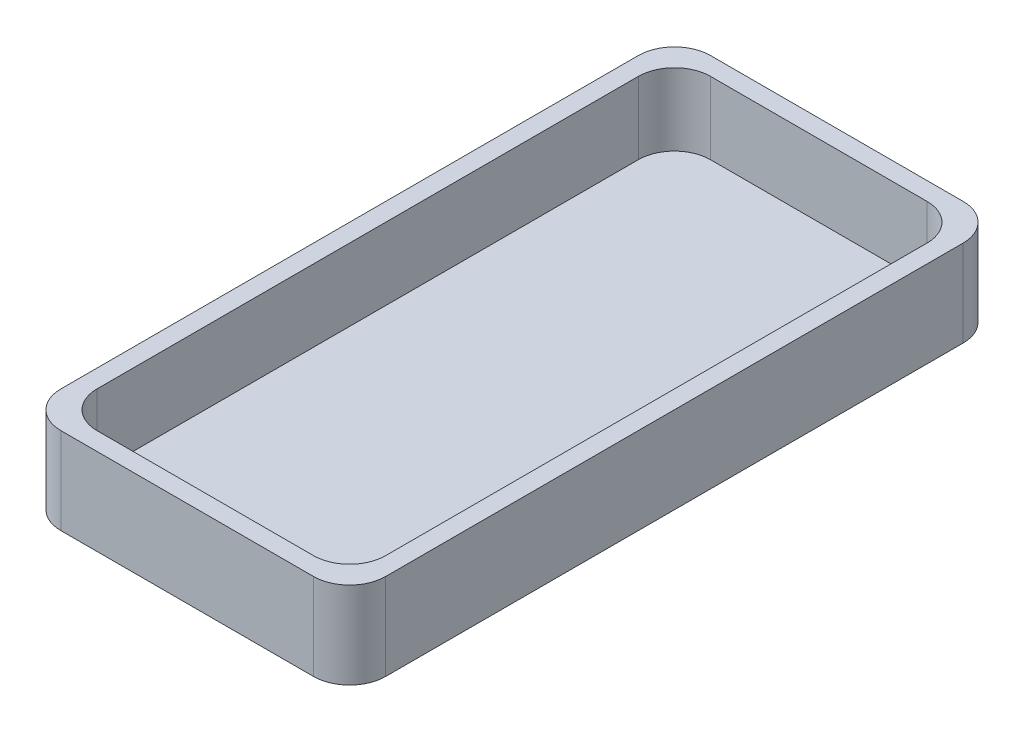
ISO-10303-21;
HEADER;
FILE_DESCRIPTION(('STEP AP214'),'2;1');
FILE_NAME('part.step','',(''),(''),'','','');
FILE_SCHEMA(('AUTOMOTIVE_DESIGN { 1 0 10303 214 1 1 1 1 }'));
ENDSEC;
DATA;
#1=APPLICATION_CONTEXT('core data for automotive mechanical design processes');
#2=APPLICATION_PROTOCOL_DEFINITION('international standard','automotive_design',2000,#1);
#3=PRODUCT_CONTEXT('',#1,'mechanical');
#4=PRODUCT('Part','Part','',(#3));
#5=PRODUCT_RELATED_PRODUCT_CATEGORY('part','',(#4));
#6=PRODUCT_DEFINITION_FORMATION('','',#4);
#7=PRODUCT_DEFINITION_CONTEXT('part definition',#1,'design');
#8=PRODUCT_DEFINITION('design','',#6,#7);
#9=PRODUCT_DEFINITION_SHAPE('','',#8);
#10=(LENGTH_UNIT() NAMED_UNIT(*) SI_UNIT(.MILLI.,.METRE.));
#11=(NAMED_UNIT(*) PLANE_ANGLE_UNIT() SI_UNIT($,.RADIAN.));
#12=(NAMED_UNIT(*) SI_UNIT($,.STERADIAN.) SOLID_ANGLE_UNIT());
#13=UNCERTAINTY_MEASURE_WITH_UNIT(LENGTH_MEASURE(1.E-05),#10,'distance_accuracy_value','');
#14=(GEOMETRIC_REPRESENTATION_CONTEXT(3) GLOBAL_UNCERTAINTY_ASSIGNED_CONTEXT((#13)) GLOBAL_UNIT_ASSIGNED_CONTEXT((#10,
#11,#12)) REPRESENTATION_CONTEXT('',''));
#15=CARTESIAN_POINT('',(0.,0.,0.));
#16=DIRECTION('',(0.,0.,1.));
#17=DIRECTION('',(1.,0.,0.));
#18=AXIS2_PLACEMENT_3D('',#15,#16,#17);
#19=CARTESIAN_POINT('',(35.,24.,80.));
#20=DIRECTION('',(0.,-1.,0.));
#21=DIRECTION('',(0.,0.,-1.));
#22=AXIS2_PLACEMENT_3D('',#19,#20,#21);
#23=CYLINDRICAL_SURFACE('',#22,10.);
#24=CARTESIAN_POINT('',(35.,0.,80.));
#25=DIRECTION('',(0.,1.,0.));
#26=DIRECTION('',(0.,0.,1.));
#27=AXIS2_PLACEMENT_3D('',#24,#25,#26);
#28=CIRCLE('',#27,10.);
#29=CARTESIAN_POINT('',(34.9999999999999,0.,90.));
#30=VERTEX_POINT('',#29);
#31=CARTESIAN_POINT('',(45.,0.,79.9999999999999));
#32=VERTEX_POINT('',#31);
#33=EDGE_CURVE('E145',#30,#32,#28,.T.);
#34=ORIENTED_EDGE('',*,*,#33,.T.);
#35=DIRECTION('',(0.,-1.,0.));
#36=VECTOR('',#35,1.);
#37=CARTESIAN_POINT('',(45.,24.,79.9999999999999));
#38=LINE('',#37,#36);
#39=CARTESIAN_POINT('',(45.,24.,79.9999999999999));
#40=VERTEX_POINT('',#39);
#41=EDGE_CURVE('E11',#40,#32,#38,.T.);
#42=ORIENTED_EDGE('',*,*,#41,.F.);
#43=CARTESIAN_POINT('',(35.,24.,80.));
#44=DIRECTION('',(0.,1.,0.));
#45=DIRECTION('',(0.,0.,1.));
#46=AXIS2_PLACEMENT_3D('',#43,#44,#45);
#47=CIRCLE('',#46,10.);
#48=CARTESIAN_POINT('',(34.9999999999999,24.,90.));
#49=VERTEX_POINT('',#48);
#50=EDGE_CURVE('E161',#49,#40,#47,.T.);
#51=ORIENTED_EDGE('',*,*,#50,.F.);
#52=DIRECTION('',(0.,-1.,0.));
#53=VECTOR('',#52,1.);
#54=CARTESIAN_POINT('',(34.9999999999999,24.,90.));
#55=LINE('',#54,#53);
#56=EDGE_CURVE('E141',#49,#30,#55,.T.);
#57=ORIENTED_EDGE('',*,*,#56,.T.);
#58=EDGE_LOOP('',(#34,#42,#51,#57));
#59=FACE_BOUND('',#58,.T.);
#60=ADVANCED_FACE('F37',(#59),#23,.T.);
#61=CARTESIAN_POINT('',(45.,24.,79.9999999999999));
#62=DIRECTION('',(-1.,0.,0.));
#63=DIRECTION('',(0.,0.,1.));
#64=AXIS2_PLACEMENT_3D('',#61,#62,#63);
#65=PLANE('',#64);
#66=DIRECTION('',(0.,0.,-1.));
#67=VECTOR('',#66,1.);
#68=CARTESIAN_POINT('',(45.,0.,79.9999999999999));
#69=LINE('',#68,#67);
#70=CARTESIAN_POINT('',(45.,0.,-79.9999999999999));
#71=VERTEX_POINT('',#70);
#72=EDGE_CURVE('E148',#32,#71,#69,.T.);
#73=ORIENTED_EDGE('',*,*,#72,.T.);
#74=DIRECTION('',(0.,-1.,0.));
#75=VECTOR('',#74,1.);
#76=CARTESIAN_POINT('',(45.,24.,-79.9999999999999));
#77=LINE('',#76,#75);
#78=CARTESIAN_POINT('',(45.,24.,-79.9999999999999));
#79=VERTEX_POINT('',#78);
#80=EDGE_CURVE('E44',#79,#71,#77,.T.);
#81=ORIENTED_EDGE('',*,*,#80,.F.);
#82=DIRECTION('',(0.,0.,-1.));
#83=VECTOR('',#82,1.);
#84=CARTESIAN_POINT('',(45.,24.,79.9999999999999));
#85=LINE('',#84,#83);
#86=EDGE_CURVE('E101',#40,#79,#85,.T.);
#87=ORIENTED_EDGE('',*,*,#86,.F.);
#88=ORIENTED_EDGE('',*,*,#41,.T.);
#89=EDGE_LOOP('',(#73,#81,#87,#88));
#90=FACE_BOUND('',#89,.T.);
#91=ADVANCED_FACE('F335',(#90),#65,.F.);
#92=CARTESIAN_POINT('',(35.,24.,-80.));
#93=DIRECTION('',(0.,-1.,0.));
#94=DIRECTION('',(0.,0.,-1.));
#95=AXIS2_PLACEMENT_3D('',#92,#93,#94);
#96=CYLINDRICAL_SURFACE('',#95,10.);
#97=CARTESIAN_POINT('',(35.,0.,-80.));
#98=DIRECTION('',(0.,1.,0.));
#99=DIRECTION('',(0.,0.,1.));
#100=AXIS2_PLACEMENT_3D('',#97,#98,#99);
#101=CIRCLE('',#100,10.);
#102=CARTESIAN_POINT('',(34.9999999999999,0.,-90.));
#103=VERTEX_POINT('',#102);
#104=EDGE_CURVE('E151',#71,#103,#101,.T.);
#105=ORIENTED_EDGE('',*,*,#104,.T.);
#106=DIRECTION('',(0.,-1.,0.));
#107=VECTOR('',#106,1.);
#108=CARTESIAN_POINT('',(34.9999999999999,24.,-90.));
#109=LINE('',#108,#107);
#110=CARTESIAN_POINT('',(34.9999999999999,24.,-90.));
#111=VERTEX_POINT('',#110);
#112=EDGE_CURVE('E168',#111,#103,#109,.T.);
#113=ORIENTED_EDGE('',*,*,#112,.F.);
#114=CARTESIAN_POINT('',(35.,24.,-80.));
#115=DIRECTION('',(0.,1.,0.));
#116=DIRECTION('',(0.,0.,1.));
#117=AXIS2_PLACEMENT_3D('',#114,#115,#116);
#118=CIRCLE('',#117,10.);
#119=EDGE_CURVE('E176',#79,#111,#118,.T.);
#120=ORIENTED_EDGE('',*,*,#119,.F.);
#121=ORIENTED_EDGE('',*,*,#80,.T.);
#122=EDGE_LOOP('',(#105,#113,#120,#121));
#123=FACE_BOUND('',#122,.T.);
#124=ADVANCED_FACE('F174',(#123),#96,.T.);
#125=CARTESIAN_POINT('',(34.9999999999999,24.,-90.));
#126=DIRECTION('',(0.,0.,1.));
#127=DIRECTION('',(1.,0.,0.));
#128=AXIS2_PLACEMENT_3D('',#125,#126,#127);
#129=PLANE('',#128);
#130=DIRECTION('',(-1.,0.,0.));
#131=VECTOR('',#130,1.);
#132=CARTESIAN_POINT('',(34.9999999999999,0.,-90.));
#133=LINE('',#132,#131);
#134=CARTESIAN_POINT('',(-35.,0.,-90.));
#135=VERTEX_POINT('',#134);
#136=EDGE_CURVE('E153',#103,#135,#133,.T.);
#137=ORIENTED_EDGE('',*,*,#136,.T.);
#138=DIRECTION('',(0.,-1.,0.));
#139=VECTOR('',#138,1.);
#140=CARTESIAN_POINT('',(-35.,24.,-90.));
#141=LINE('',#140,#139);
#142=CARTESIAN_POINT('',(-35.,24.,-90.));
#143=VERTEX_POINT('',#142);
#144=EDGE_CURVE('E165',#143,#135,#141,.T.);
#145=ORIENTED_EDGE('',*,*,#144,.F.);
#146=DIRECTION('',(-1.,0.,0.));
#147=VECTOR('',#146,1.);
#148=CARTESIAN_POINT('',(34.9999999999999,24.,-90.));
#149=LINE('',#148,#147);
#150=EDGE_CURVE('E188',#111,#143,#149,.T.);
#151=ORIENTED_EDGE('',*,*,#150,.F.);
#152=ORIENTED_EDGE('',*,*,#112,.T.);
#153=EDGE_LOOP('',(#137,#145,#151,#152));
#154=FACE_BOUND('',#153,.T.);
#155=ADVANCED_FACE('F184',(#154),#129,.F.);
#156=CARTESIAN_POINT('',(-35.,24.,-80.));
#157=DIRECTION('',(0.,-1.,0.));
#158=DIRECTION('',(0.,0.,-1.));
#159=AXIS2_PLACEMENT_3D('',#156,#157,#158);
#160=CYLINDRICAL_SURFACE('',#159,10.);
#161=CARTESIAN_POINT('',(-35.,0.,-80.));
#162=DIRECTION('',(0.,1.,0.));
#163=DIRECTION('',(0.,0.,-1.));
#164=AXIS2_PLACEMENT_3D('',#161,#162,#163);
#165=CIRCLE('',#164,10.);
#166=CARTESIAN_POINT('',(-45.,0.,-79.9999999999999));
#167=VERTEX_POINT('',#166);
#168=EDGE_CURVE('E155',#135,#167,#165,.T.);
#169=ORIENTED_EDGE('',*,*,#168,.T.);
#170=DIRECTION('',(0.,-1.,0.));
#171=VECTOR('',#170,1.);
#172=CARTESIAN_POINT('',(-45.,24.,-79.9999999999999));
#173=LINE('',#172,#171);
#174=CARTESIAN_POINT('',(-45.,24.,-79.9999999999999));
#175=VERTEX_POINT('',#174);
#176=EDGE_CURVE('E136',#175,#167,#173,.T.);
#177=ORIENTED_EDGE('',*,*,#176,.F.);
#178=CARTESIAN_POINT('',(-35.,24.,-80.));
#179=DIRECTION('',(0.,1.,0.));
#180=DIRECTION('',(0.,0.,-1.));
#181=AXIS2_PLACEMENT_3D('',#178,#179,#180);
#182=CIRCLE('',#181,10.);
#183=EDGE_CURVE('E124',#143,#175,#182,.T.);
#184=ORIENTED_EDGE('',*,*,#183,.F.);
#185=ORIENTED_EDGE('',*,*,#144,.T.);
#186=EDGE_LOOP('',(#169,#177,#184,#185));
#187=FACE_BOUND('',#186,.T.);
#188=ADVANCED_FACE('F187',(#187),#160,.T.);
#189=CARTESIAN_POINT('',(-45.,24.,-79.9999999999999));
#190=DIRECTION('',(1.,0.,0.));
#191=DIRECTION('',(0.,0.,-1.));
#192=AXIS2_PLACEMENT_3D('',#189,#190,#191);
#193=PLANE('',#192);
#194=DIRECTION('',(0.,0.,1.));
#195=VECTOR('',#194,1.);
#196=CARTESIAN_POINT('',(-45.,0.,-79.9999999999999));
#197=LINE('',#196,#195);
#198=CARTESIAN_POINT('',(-45.,0.,79.9999999999999));
#199=VERTEX_POINT('',#198);
#200=EDGE_CURVE('E133',#167,#199,#197,.T.);
#201=ORIENTED_EDGE('',*,*,#200,.T.);
#202=DIRECTION('',(0.,-1.,0.));
#203=VECTOR('',#202,1.);
#204=CARTESIAN_POINT('',(-45.,24.,79.9999999999999));
#205=LINE('',#204,#203);
#206=CARTESIAN_POINT('',(-45.,24.,79.9999999999999));
#207=VERTEX_POINT('',#206);
#208=EDGE_CURVE('E130',#207,#199,#205,.T.);
#209=ORIENTED_EDGE('',*,*,#208,.F.);
#210=DIRECTION('',(0.,0.,1.));
#211=VECTOR('',#210,1.);
#212=CARTESIAN_POINT('',(-45.,24.,-79.9999999999999));
#213=LINE('',#212,#211);
#214=EDGE_CURVE('E117',#175,#207,#213,.T.);
#215=ORIENTED_EDGE('',*,*,#214,.F.);
#216=ORIENTED_EDGE('',*,*,#176,.T.);
#217=EDGE_LOOP('',(#201,#209,#215,#216));
#218=FACE_BOUND('',#217,.T.);
#219=ADVANCED_FACE('F131',(#218),#193,.F.);
#220=CARTESIAN_POINT('',(-35.,24.,80.));
#221=DIRECTION('',(0.,-1.,0.));
#222=DIRECTION('',(0.,0.,-1.));
#223=AXIS2_PLACEMENT_3D('',#220,#221,#222);
#224=CYLINDRICAL_SURFACE('',#223,10.);
#225=CARTESIAN_POINT('',(-35.,0.,80.));
#226=DIRECTION('',(0.,1.,0.));
#227=DIRECTION('',(0.,0.,1.));
#228=AXIS2_PLACEMENT_3D('',#225,#226,#227);
#229=CIRCLE('',#228,10.);
#230=CARTESIAN_POINT('',(-34.9999999999999,0.,90.));
#231=VERTEX_POINT('',#230);
#232=EDGE_CURVE('E158',#199,#231,#229,.T.);
#233=ORIENTED_EDGE('',*,*,#232,.T.);
#234=DIRECTION('',(0.,-1.,0.));
#235=VECTOR('',#234,1.);
#236=CARTESIAN_POINT('',(-34.9999999999999,24.,90.));
#237=LINE('',#236,#235);
#238=CARTESIAN_POINT('',(-34.9999999999999,24.,90.));
#239=VERTEX_POINT('',#238);
#240=EDGE_CURVE('E137',#239,#231,#237,.T.);
#241=ORIENTED_EDGE('',*,*,#240,.F.);
#242=CARTESIAN_POINT('',(-35.,24.,80.));
#243=DIRECTION('',(0.,1.,0.));
#244=DIRECTION('',(0.,0.,1.));
#245=AXIS2_PLACEMENT_3D('',#242,#243,#244);
#246=CIRCLE('',#245,10.);
#247=EDGE_CURVE('E121',#207,#239,#246,.T.);
#248=ORIENTED_EDGE('',*,*,#247,.F.);
#249=ORIENTED_EDGE('',*,*,#208,.T.);
#250=EDGE_LOOP('',(#233,#241,#248,#249));
#251=FACE_BOUND('',#250,.T.);
#252=ADVANCED_FACE('F139',(#251),#224,.T.);
#253=CARTESIAN_POINT('',(-34.9999999999999,24.,90.));
#254=DIRECTION('',(0.,0.,-1.));
#255=DIRECTION('',(-1.,0.,0.));
#256=AXIS2_PLACEMENT_3D('',#253,#254,#255);
#257=PLANE('',#256);
#258=DIRECTION('',(1.,0.,0.));
#259=VECTOR('',#258,1.);
#260=CARTESIAN_POINT('',(-34.9999999999999,0.,90.));
#261=LINE('',#260,#259);
#262=EDGE_CURVE('E93',#231,#30,#261,.T.);
#263=ORIENTED_EDGE('',*,*,#262,.T.);
#264=ORIENTED_EDGE('',*,*,#56,.F.);
#265=DIRECTION('',(1.,0.,0.));
#266=VECTOR('',#265,1.);
#267=CARTESIAN_POINT('',(-34.9999999999999,24.,90.));
#268=LINE('',#267,#266);
#269=EDGE_CURVE('E60',#239,#49,#268,.T.);
#270=ORIENTED_EDGE('',*,*,#269,.F.);
#271=ORIENTED_EDGE('',*,*,#240,.T.);
#272=EDGE_LOOP('',(#263,#264,#270,#271));
#273=FACE_BOUND('',#272,.T.);
#274=ADVANCED_FACE('F342',(#273),#257,.F.);
#275=CARTESIAN_POINT('',(35.,24.,80.));
#276=DIRECTION('',(0.,1.,0.));
#277=DIRECTION('',(0.,0.,1.));
#278=AXIS2_PLACEMENT_3D('',#275,#276,#277);
#279=PLANE('',#278);
#280=CARTESIAN_POINT('',(30.,24.,75.));
#281=DIRECTION('',(0.,1.,0.));
#282=DIRECTION('',(0.,0.,1.));
#283=AXIS2_PLACEMENT_3D('',#280,#281,#282);
#284=CIRCLE('',#283,10.);
#285=CARTESIAN_POINT('',(29.9999999999999,24.,85.));
#286=VERTEX_POINT('',#285);
#287=CARTESIAN_POINT('',(40.,24.,74.9999999999999));
#288=VERTEX_POINT('',#287);
#289=EDGE_CURVE('E51',#286,#288,#284,.T.);
#290=ORIENTED_EDGE('',*,*,#289,.F.);
#291=DIRECTION('',(1.,0.,0.));
#292=VECTOR('',#291,1.);
#293=CARTESIAN_POINT('',(-29.9999999999999,24.,85.));
#294=LINE('',#293,#292);
#295=CARTESIAN_POINT('',(-29.9999999999999,24.,85.));
#296=VERTEX_POINT('',#295);
#297=EDGE_CURVE('E216',#296,#286,#294,.T.);
#298=ORIENTED_EDGE('',*,*,#297,.F.);
#299=CARTESIAN_POINT('',(-30.,24.,75.));
#300=DIRECTION('',(0.,1.,0.));
#301=DIRECTION('',(0.,0.,1.));
#302=AXIS2_PLACEMENT_3D('',#299,#300,#301);
#303=CIRCLE('',#302,9.99999999999999);
#304=CARTESIAN_POINT('',(-40.,24.,74.9999999999999));
#305=VERTEX_POINT('',#304);
#306=EDGE_CURVE('E220',#305,#296,#303,.T.);
#307=ORIENTED_EDGE('',*,*,#306,.F.);
#308=DIRECTION('',(0.,0.,1.));
#309=VECTOR('',#308,1.);
#310=CARTESIAN_POINT('',(-40.,24.,-74.9999999999999));
#311=LINE('',#310,#309);
#312=CARTESIAN_POINT('',(-40.,24.,-74.9999999999999));
#313=VERTEX_POINT('',#312);
#314=EDGE_CURVE('E223',#313,#305,#311,.T.);
#315=ORIENTED_EDGE('',*,*,#314,.F.);
#316=CARTESIAN_POINT('',(-30.,24.,-75.));
#317=DIRECTION('',(0.,1.,0.));
#318=DIRECTION('',(0.,0.,-1.));
#319=AXIS2_PLACEMENT_3D('',#316,#317,#318);
#320=CIRCLE('',#319,9.99999999999999);
#321=CARTESIAN_POINT('',(-30.,24.,-85.));
#322=VERTEX_POINT('',#321);
#323=EDGE_CURVE('E226',#322,#313,#320,.T.);
#324=ORIENTED_EDGE('',*,*,#323,.F.);
#325=DIRECTION('',(-1.,0.,0.));
#326=VECTOR('',#325,1.);
#327=CARTESIAN_POINT('',(29.9999999999999,24.,-85.));
#328=LINE('',#327,#326);
#329=CARTESIAN_POINT('',(29.9999999999999,24.,-85.));
#330=VERTEX_POINT('',#329);
#331=EDGE_CURVE('E229',#330,#322,#328,.T.);
#332=ORIENTED_EDGE('',*,*,#331,.F.);
#333=CARTESIAN_POINT('',(30.,24.,-75.));
#334=DIRECTION('',(0.,1.,0.));
#335=DIRECTION('',(0.,0.,1.));
#336=AXIS2_PLACEMENT_3D('',#333,#334,#335);
#337=CIRCLE('',#336,10.);
#338=CARTESIAN_POINT('',(40.,24.,-75.));
#339=VERTEX_POINT('',#338);
#340=EDGE_CURVE('E232',#339,#330,#337,.T.);
#341=ORIENTED_EDGE('',*,*,#340,.F.);
#342=DIRECTION('',(0.,0.,-1.));
#343=VECTOR('',#342,1.);
#344=CARTESIAN_POINT('',(40.,24.,74.9999999999999));
#345=LINE('',#344,#343);
#346=EDGE_CURVE('E235',#288,#339,#345,.T.);
#347=ORIENTED_EDGE('',*,*,#346,.F.);
#348=EDGE_LOOP('',(#290,#298,#307,#315,#324,#332,#341,#347));
#349=FACE_BOUND('',#348,.T.);
#350=ORIENTED_EDGE('',*,*,#50,.T.);
#351=ORIENTED_EDGE('',*,*,#86,.T.);
#352=ORIENTED_EDGE('',*,*,#119,.T.);
#353=ORIENTED_EDGE('',*,*,#150,.T.);
#354=ORIENTED_EDGE('',*,*,#183,.T.);
#355=ORIENTED_EDGE('',*,*,#214,.T.);
#356=ORIENTED_EDGE('',*,*,#247,.T.);
#357=ORIENTED_EDGE('',*,*,#269,.T.);
#358=EDGE_LOOP('',(#350,#351,#352,#353,#354,#355,#356,#357));
#359=FACE_BOUND('',#358,.T.);
#360=ADVANCED_FACE('F119',(#349,#359),#279,.T.);
#361=CARTESIAN_POINT('',(35.,0.,80.));
#362=DIRECTION('',(0.,1.,0.));
#363=DIRECTION('',(0.,0.,1.));
#364=AXIS2_PLACEMENT_3D('',#361,#362,#363);
#365=PLANE('',#364);
#366=ORIENTED_EDGE('',*,*,#33,.F.);
#367=ORIENTED_EDGE('',*,*,#262,.F.);
#368=ORIENTED_EDGE('',*,*,#232,.F.);
#369=ORIENTED_EDGE('',*,*,#200,.F.);
#370=ORIENTED_EDGE('',*,*,#168,.F.);
#371=ORIENTED_EDGE('',*,*,#136,.F.);
#372=ORIENTED_EDGE('',*,*,#104,.F.);
#373=ORIENTED_EDGE('',*,*,#72,.F.);
#374=EDGE_LOOP('',(#366,#367,#368,#369,#370,#371,#372,#373));
#375=FACE_BOUND('',#374,.T.);
#376=ADVANCED_FACE('F180',(#375),#365,.F.);
#377=CARTESIAN_POINT('',(30.,4.,75.));
#378=DIRECTION('',(0.,1.,0.));
#379=DIRECTION('',(0.,0.,1.));
#380=AXIS2_PLACEMENT_3D('',#377,#378,#379);
#381=CYLINDRICAL_SURFACE('',#380,10.);
#382=ORIENTED_EDGE('',*,*,#289,.T.);
#383=DIRECTION('',(0.,1.,0.));
#384=VECTOR('',#383,1.);
#385=CARTESIAN_POINT('',(40.,4.,74.9999999999999));
#386=LINE('',#385,#384);
#387=CARTESIAN_POINT('',(40.,4.,74.9999999999999));
#388=VERTEX_POINT('',#387);
#389=EDGE_CURVE('E194',#388,#288,#386,.T.);
#390=ORIENTED_EDGE('',*,*,#389,.F.);
#391=CARTESIAN_POINT('',(30.,4.,75.));
#392=DIRECTION('',(0.,1.,0.));
#393=DIRECTION('',(0.,0.,1.));
#394=AXIS2_PLACEMENT_3D('',#391,#392,#393);
#395=CIRCLE('',#394,10.);
#396=CARTESIAN_POINT('',(29.9999999999999,4.,85.));
#397=VERTEX_POINT('',#396);
#398=EDGE_CURVE('E219',#397,#388,#395,.T.);
#399=ORIENTED_EDGE('',*,*,#398,.F.);
#400=DIRECTION('',(0.,1.,0.));
#401=VECTOR('',#400,1.);
#402=CARTESIAN_POINT('',(29.9999999999999,4.,85.));
#403=LINE('',#402,#401);
#404=EDGE_CURVE('E149',#397,#286,#403,.T.);
#405=ORIENTED_EDGE('',*,*,#404,.T.);
#406=EDGE_LOOP('',(#382,#390,#399,#405));
#407=FACE_BOUND('',#406,.T.);
#408=ADVANCED_FACE('F268',(#407),#381,.F.);
#409=CARTESIAN_POINT('',(-29.9999999999999,4.,85.));
#410=DIRECTION('',(0.,0.,1.));
#411=DIRECTION('',(1.,0.,0.));
#412=AXIS2_PLACEMENT_3D('',#409,#410,#411);
#413=PLANE('',#412);
#414=ORIENTED_EDGE('',*,*,#297,.T.);
#415=ORIENTED_EDGE('',*,*,#404,.F.);
#416=DIRECTION('',(1.,0.,0.));
#417=VECTOR('',#416,1.);
#418=CARTESIAN_POINT('',(-29.9999999999999,4.,85.));
#419=LINE('',#418,#417);
#420=CARTESIAN_POINT('',(-29.9999999999999,4.,85.));
#421=VERTEX_POINT('',#420);
#422=EDGE_CURVE('E197',#421,#397,#419,.T.);
#423=ORIENTED_EDGE('',*,*,#422,.F.);
#424=DIRECTION('',(0.,1.,0.));
#425=VECTOR('',#424,1.);
#426=CARTESIAN_POINT('',(-29.9999999999999,4.,85.));
#427=LINE('',#426,#425);
#428=EDGE_CURVE('E212',#421,#296,#427,.T.);
#429=ORIENTED_EDGE('',*,*,#428,.T.);
#430=EDGE_LOOP('',(#414,#415,#423,#429));
#431=FACE_BOUND('',#430,.T.);
#432=ADVANCED_FACE('F288',(#431),#413,.F.);
#433=CARTESIAN_POINT('',(-30.,4.,75.));
#434=DIRECTION('',(0.,1.,0.));
#435=DIRECTION('',(0.,0.,1.));
#436=AXIS2_PLACEMENT_3D('',#433,#434,#435);
#437=CYLINDRICAL_SURFACE('',#436,9.99999999999999);
#438=ORIENTED_EDGE('',*,*,#306,.T.);
#439=ORIENTED_EDGE('',*,*,#428,.F.);
#440=CARTESIAN_POINT('',(-30.,4.,75.));
#441=DIRECTION('',(0.,1.,0.));
#442=DIRECTION('',(0.,0.,1.));
#443=AXIS2_PLACEMENT_3D('',#440,#441,#442);
#444=CIRCLE('',#443,9.99999999999999);
#445=CARTESIAN_POINT('',(-40.,4.,74.9999999999999));
#446=VERTEX_POINT('',#445);
#447=EDGE_CURVE('E241',#446,#421,#444,.T.);
#448=ORIENTED_EDGE('',*,*,#447,.F.);
#449=DIRECTION('',(0.,1.,0.));
#450=VECTOR('',#449,1.);
#451=CARTESIAN_POINT('',(-40.,4.,74.9999999999999));
#452=LINE('',#451,#450);
#453=EDGE_CURVE('E209',#446,#305,#452,.T.);
#454=ORIENTED_EDGE('',*,*,#453,.T.);
#455=EDGE_LOOP('',(#438,#439,#448,#454));
#456=FACE_BOUND('',#455,.T.);
#457=ADVANCED_FACE('F293',(#456),#437,.F.);
#458=CARTESIAN_POINT('',(-40.,4.,-74.9999999999999));
#459=DIRECTION('',(-1.,0.,0.));
#460=DIRECTION('',(0.,0.,1.));
#461=AXIS2_PLACEMENT_3D('',#458,#459,#460);
#462=PLANE('',#461);
#463=ORIENTED_EDGE('',*,*,#314,.T.);
#464=ORIENTED_EDGE('',*,*,#453,.F.);
#465=DIRECTION('',(0.,0.,1.));
#466=VECTOR('',#465,1.);
#467=CARTESIAN_POINT('',(-40.,4.,-74.9999999999999));
#468=LINE('',#467,#466);
#469=CARTESIAN_POINT('',(-40.,4.,-74.9999999999999));
#470=VERTEX_POINT('',#469);
#471=EDGE_CURVE('E244',#470,#446,#468,.T.);
#472=ORIENTED_EDGE('',*,*,#471,.F.);
#473=DIRECTION('',(0.,1.,0.));
#474=VECTOR('',#473,1.);
#475=CARTESIAN_POINT('',(-40.,4.,-74.9999999999999));
#476=LINE('',#475,#474);
#477=EDGE_CURVE('E206',#470,#313,#476,.T.);
#478=ORIENTED_EDGE('',*,*,#477,.T.);
#479=EDGE_LOOP('',(#463,#464,#472,#478));
#480=FACE_BOUND('',#479,.T.);
#481=ADVANCED_FACE('F319',(#480),#462,.F.);
#482=CARTESIAN_POINT('',(-30.,4.,-75.));
#483=DIRECTION('',(0.,1.,0.));
#484=DIRECTION('',(0.,0.,1.));
#485=AXIS2_PLACEMENT_3D('',#482,#483,#484);
#486=CYLINDRICAL_SURFACE('',#485,9.99999999999999);
#487=ORIENTED_EDGE('',*,*,#323,.T.);
#488=ORIENTED_EDGE('',*,*,#477,.F.);
#489=CARTESIAN_POINT('',(-30.,4.,-75.));
#490=DIRECTION('',(0.,1.,0.));
#491=DIRECTION('',(0.,0.,-1.));
#492=AXIS2_PLACEMENT_3D('',#489,#490,#491);
#493=CIRCLE('',#492,9.99999999999999);
#494=CARTESIAN_POINT('',(-30.,4.,-85.));
#495=VERTEX_POINT('',#494);
#496=EDGE_CURVE('E247',#495,#470,#493,.T.);
#497=ORIENTED_EDGE('',*,*,#496,.F.);
#498=DIRECTION('',(0.,1.,0.));
#499=VECTOR('',#498,1.);
#500=CARTESIAN_POINT('',(-30.,4.,-85.));
#501=LINE('',#500,#499);
#502=EDGE_CURVE('E203',#495,#322,#501,.T.);
#503=ORIENTED_EDGE('',*,*,#502,.T.);
#504=EDGE_LOOP('',(#487,#488,#497,#503));
#505=FACE_BOUND('',#504,.T.);
#506=ADVANCED_FACE('F322',(#505),#486,.F.);
#507=CARTESIAN_POINT('',(29.9999999999999,4.,-85.));
#508=DIRECTION('',(0.,0.,-1.));
#509=DIRECTION('',(-1.,0.,0.));
#510=AXIS2_PLACEMENT_3D('',#507,#508,#509);
#511=PLANE('',#510);
#512=ORIENTED_EDGE('',*,*,#331,.T.);
#513=ORIENTED_EDGE('',*,*,#502,.F.);
#514=DIRECTION('',(-1.,0.,0.));
#515=VECTOR('',#514,1.);
#516=CARTESIAN_POINT('',(29.9999999999999,4.,-85.));
#517=LINE('',#516,#515);
#518=CARTESIAN_POINT('',(29.9999999999999,4.,-85.));
#519=VERTEX_POINT('',#518);
#520=EDGE_CURVE('E250',#519,#495,#517,.T.);
#521=ORIENTED_EDGE('',*,*,#520,.F.);
#522=DIRECTION('',(0.,1.,0.));
#523=VECTOR('',#522,1.);
#524=CARTESIAN_POINT('',(29.9999999999999,4.,-85.));
#525=LINE('',#524,#523);
#526=EDGE_CURVE('E200',#519,#330,#525,.T.);
#527=ORIENTED_EDGE('',*,*,#526,.T.);
#528=EDGE_LOOP('',(#512,#513,#521,#527));
#529=FACE_BOUND('',#528,.T.);
#530=ADVANCED_FACE('F325',(#529),#511,.F.);
#531=CARTESIAN_POINT('',(30.,4.,-75.));
#532=DIRECTION('',(0.,1.,0.));
#533=DIRECTION('',(0.,0.,1.));
#534=AXIS2_PLACEMENT_3D('',#531,#532,#533);
#535=CYLINDRICAL_SURFACE('',#534,10.);
#536=ORIENTED_EDGE('',*,*,#340,.T.);
#537=ORIENTED_EDGE('',*,*,#526,.F.);
#538=CARTESIAN_POINT('',(30.,4.,-75.));
#539=DIRECTION('',(0.,1.,0.));
#540=DIRECTION('',(0.,0.,1.));
#541=AXIS2_PLACEMENT_3D('',#538,#539,#540);
#542=CIRCLE('',#541,10.);
#543=CARTESIAN_POINT('',(40.,4.,-75.));
#544=VERTEX_POINT('',#543);
#545=EDGE_CURVE('E253',#544,#519,#542,.T.);
#546=ORIENTED_EDGE('',*,*,#545,.F.);
#547=DIRECTION('',(0.,1.,0.));
#548=VECTOR('',#547,1.);
#549=CARTESIAN_POINT('',(40.,4.,-75.));
#550=LINE('',#549,#548);
#551=EDGE_CURVE('E196',#544,#339,#550,.T.);
#552=ORIENTED_EDGE('',*,*,#551,.T.);
#553=EDGE_LOOP('',(#536,#537,#546,#552));
#554=FACE_BOUND('',#553,.T.);
#555=ADVANCED_FACE('F308',(#554),#535,.F.);
#556=CARTESIAN_POINT('',(40.,4.,74.9999999999999));
#557=DIRECTION('',(1.,0.,0.));
#558=DIRECTION('',(0.,0.,-1.));
#559=AXIS2_PLACEMENT_3D('',#556,#557,#558);
#560=PLANE('',#559);
#561=ORIENTED_EDGE('',*,*,#346,.T.);
#562=ORIENTED_EDGE('',*,*,#551,.F.);
#563=DIRECTION('',(0.,0.,-1.));
#564=VECTOR('',#563,1.);
#565=CARTESIAN_POINT('',(40.,4.,74.9999999999999));
#566=LINE('',#565,#564);
#567=EDGE_CURVE('E256',#388,#544,#566,.T.);
#568=ORIENTED_EDGE('',*,*,#567,.F.);
#569=ORIENTED_EDGE('',*,*,#389,.T.);
#570=EDGE_LOOP('',(#561,#562,#568,#569));
#571=FACE_BOUND('',#570,.T.);
#572=ADVANCED_FACE('F302',(#571),#560,.F.);
#573=CARTESIAN_POINT('',(30.,4.,75.));
#574=DIRECTION('',(0.,1.,0.));
#575=DIRECTION('',(0.,0.,1.));
#576=AXIS2_PLACEMENT_3D('',#573,#574,#575);
#577=PLANE('',#576);
#578=ORIENTED_EDGE('',*,*,#398,.T.);
#579=ORIENTED_EDGE('',*,*,#567,.T.);
#580=ORIENTED_EDGE('',*,*,#545,.T.);
#581=ORIENTED_EDGE('',*,*,#520,.T.);
#582=ORIENTED_EDGE('',*,*,#496,.T.);
#583=ORIENTED_EDGE('',*,*,#471,.T.);
#584=ORIENTED_EDGE('',*,*,#447,.T.);
#585=ORIENTED_EDGE('',*,*,#422,.T.);
#586=EDGE_LOOP('',(#578,#579,#580,#581,#582,#583,#584,#585));
#587=FACE_BOUND('',#586,.T.);
#588=ADVANCED_FACE('F263',(#587),#577,.T.);
#589=CLOSED_SHELL('',(#60,#91,#124,#155,#188,#219,#252,#274,#360,#376,#408,#432,#457,#481,#506,
#530,#555,#572,#588));
#590=MANIFOLD_SOLID_BREP('B2',#589);
#591=ADVANCED_BREP_SHAPE_REPRESENTATION('',(#18,#590),#14);
#592=SHAPE_DEFINITION_REPRESENTATION(#9,#591);
ENDSEC;
END-ISO-10303-21;
